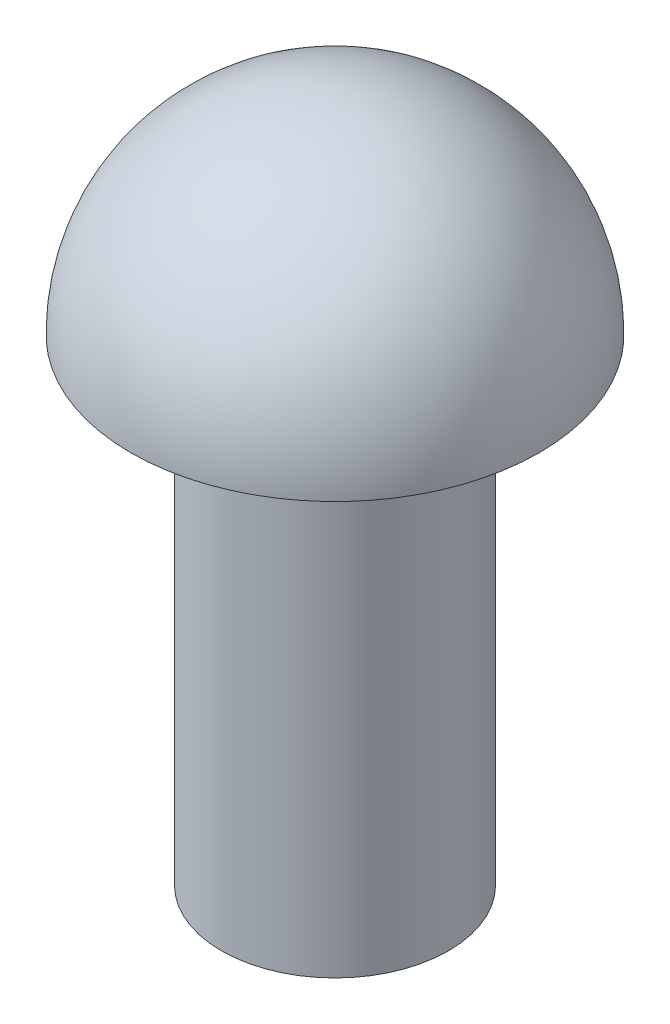
ISO-10303-21;
HEADER;
FILE_DESCRIPTION(('STEP AP214'),'2;1');
FILE_NAME('part.step','',(''),(''),'','','');
FILE_SCHEMA(('AUTOMOTIVE_DESIGN { 1 0 10303 214 1 1 1 1 }'));
ENDSEC;
DATA;
#1=APPLICATION_CONTEXT('core data for automotive mechanical design processes');
#2=APPLICATION_PROTOCOL_DEFINITION('international standard','automotive_design',2000,#1);
#3=PRODUCT_CONTEXT('',#1,'mechanical');
#4=PRODUCT('Part','Part','',(#3));
#5=PRODUCT_RELATED_PRODUCT_CATEGORY('part','',(#4));
#6=PRODUCT_DEFINITION_FORMATION('','',#4);
#7=PRODUCT_DEFINITION_CONTEXT('part definition',#1,'design');
#8=PRODUCT_DEFINITION('design','',#6,#7);
#9=PRODUCT_DEFINITION_SHAPE('','',#8);
#10=(LENGTH_UNIT() NAMED_UNIT(*) SI_UNIT(.MILLI.,.METRE.));
#11=(NAMED_UNIT(*) PLANE_ANGLE_UNIT() SI_UNIT($,.RADIAN.));
#12=(NAMED_UNIT(*) SI_UNIT($,.STERADIAN.) SOLID_ANGLE_UNIT());
#13=UNCERTAINTY_MEASURE_WITH_UNIT(LENGTH_MEASURE(1.E-05),#10,'distance_accuracy_value','');
#14=(GEOMETRIC_REPRESENTATION_CONTEXT(3) GLOBAL_UNCERTAINTY_ASSIGNED_CONTEXT((#13)) GLOBAL_UNIT_ASSIGNED_CONTEXT((#10,
#11,#12)) REPRESENTATION_CONTEXT('',''));
#15=CARTESIAN_POINT('',(0.,0.,0.));
#16=DIRECTION('',(0.,0.,1.));
#17=DIRECTION('',(1.,0.,0.));
#18=AXIS2_PLACEMENT_3D('',#15,#16,#17);
#19=CARTESIAN_POINT('',(0.,-21.,0.));
#20=DIRECTION('',(0.,1.,0.));
#21=DIRECTION('',(0.,0.,1.));
#22=AXIS2_PLACEMENT_3D('',#19,#20,#21);
#23=CYLINDRICAL_SURFACE('',#22,5.);
#24=CARTESIAN_POINT('',(0.,-21.,0.));
#25=DIRECTION('',(0.,1.,0.));
#26=DIRECTION('',(0.,0.,1.));
#27=AXIS2_PLACEMENT_3D('',#24,#25,#26);
#28=CIRCLE('',#27,5.);
#29=CARTESIAN_POINT('',(0.,-21.,5.));
#30=VERTEX_POINT('',#29);
#31=EDGE_CURVE('E10',#30,#30,#28,.T.);
#32=CARTESIAN_POINT('',(0.,0.,0.));
#33=DIRECTION('',(0.,1.,0.));
#34=DIRECTION('',(0.,0.,1.));
#35=AXIS2_PLACEMENT_3D('',#32,#33,#34);
#36=CIRCLE('',#35,5.);
#37=CARTESIAN_POINT('',(0.,0.,5.));
#38=VERTEX_POINT('',#37);
#39=EDGE_CURVE('E46',#38,#38,#36,.T.);
#40=CARTESIAN_POINT('',(0.,-21.,5.));
#41=CARTESIAN_POINT('',(0.,-20.78125,5.));
#42=CARTESIAN_POINT('',(0.,-20.5625,5.));
#43=CARTESIAN_POINT('',(0.,-20.125,5.));
#44=CARTESIAN_POINT('',(0.,-19.90625,5.));
#45=CARTESIAN_POINT('',(0.,-19.46875,5.));
#46=CARTESIAN_POINT('',(0.,-19.25,5.));
#47=CARTESIAN_POINT('',(0.,-18.8125,5.));
#48=CARTESIAN_POINT('',(0.,-18.59375,5.));
#49=CARTESIAN_POINT('',(0.,-18.15625,5.));
#50=CARTESIAN_POINT('',(0.,-17.9375,5.));
#51=CARTESIAN_POINT('',(0.,-17.5,5.));
#52=CARTESIAN_POINT('',(0.,-17.28125,5.));
#53=CARTESIAN_POINT('',(0.,-16.84375,5.));
#54=CARTESIAN_POINT('',(0.,-16.625,5.));
#55=CARTESIAN_POINT('',(0.,-16.1875,5.));
#56=CARTESIAN_POINT('',(0.,-15.96875,5.));
#57=CARTESIAN_POINT('',(0.,-15.53125,5.));
#58=CARTESIAN_POINT('',(0.,-15.3125,5.));
#59=CARTESIAN_POINT('',(0.,-14.875,5.));
#60=CARTESIAN_POINT('',(0.,-14.65625,5.));
#61=CARTESIAN_POINT('',(0.,-14.21875,5.));
#62=CARTESIAN_POINT('',(0.,-14.,5.));
#63=CARTESIAN_POINT('',(0.,-13.5625,5.));
#64=CARTESIAN_POINT('',(0.,-13.34375,5.));
#65=CARTESIAN_POINT('',(0.,-12.90625,5.));
#66=CARTESIAN_POINT('',(0.,-12.6875,5.));
#67=CARTESIAN_POINT('',(0.,-12.25,5.));
#68=CARTESIAN_POINT('',(0.,-12.03125,5.));
#69=CARTESIAN_POINT('',(0.,-11.59375,5.));
#70=CARTESIAN_POINT('',(0.,-11.375,5.));
#71=CARTESIAN_POINT('',(0.,-10.9375,5.));
#72=CARTESIAN_POINT('',(0.,-10.71875,5.));
#73=CARTESIAN_POINT('',(0.,-10.28125,5.));
#74=CARTESIAN_POINT('',(0.,-10.0625,5.));
#75=CARTESIAN_POINT('',(0.,-9.625,5.));
#76=CARTESIAN_POINT('',(0.,-9.40625,5.));
#77=CARTESIAN_POINT('',(0.,-8.96875,5.));
#78=CARTESIAN_POINT('',(0.,-8.75,5.));
#79=CARTESIAN_POINT('',(0.,-8.3125,5.));
#80=CARTESIAN_POINT('',(0.,-8.09375,5.));
#81=CARTESIAN_POINT('',(0.,-7.65625,5.));
#82=CARTESIAN_POINT('',(0.,-7.4375,5.));
#83=CARTESIAN_POINT('',(0.,-7.,5.));
#84=CARTESIAN_POINT('',(0.,-6.78125,5.));
#85=CARTESIAN_POINT('',(0.,-6.34375,5.));
#86=CARTESIAN_POINT('',(0.,-6.125,5.));
#87=CARTESIAN_POINT('',(0.,-5.6875,5.));
#88=CARTESIAN_POINT('',(0.,-5.46875,5.));
#89=CARTESIAN_POINT('',(0.,-5.03125,5.));
#90=CARTESIAN_POINT('',(0.,-4.8125,5.));
#91=CARTESIAN_POINT('',(0.,-4.375,5.));
#92=CARTESIAN_POINT('',(0.,-4.15625,5.));
#93=CARTESIAN_POINT('',(0.,-3.71875,5.));
#94=CARTESIAN_POINT('',(0.,-3.5,5.));
#95=CARTESIAN_POINT('',(0.,-3.0625,5.));
#96=CARTESIAN_POINT('',(0.,-2.84375,5.));
#97=CARTESIAN_POINT('',(0.,-2.40625,5.));
#98=CARTESIAN_POINT('',(0.,-2.1875,5.));
#99=CARTESIAN_POINT('',(0.,-1.75,5.));
#100=CARTESIAN_POINT('',(0.,-1.53125,5.));
#101=CARTESIAN_POINT('',(0.,-1.09375,5.));
#102=CARTESIAN_POINT('',(0.,-0.875000000000001,5.));
#103=CARTESIAN_POINT('',(0.,-0.4375,5.));
#104=CARTESIAN_POINT('',(0.,-0.21875,5.));
#105=CARTESIAN_POINT('',(0.,0.,5.));
#106=B_SPLINE_CURVE_WITH_KNOTS('',3,(#40,#41,#42,#43,#44,#45,#46,#47,#48,#49,#50,#51,#52,#53,
#54,#55,#56,#57,#58,#59,#60,#61,#62,#63,#64,#65,#66,#67,#68,#69,#70,#71,#72,#73,#74,#75,#76,#77,
#78,#79,#80,#81,#82,#83,#84,#85,#86,#87,#88,#89,#90,#91,#92,#93,#94,#95,#96,#97,#98,#99,#100,
#101,#102,#103,#104,#105),.UNSPECIFIED.,.F.,.F.,(4,2,2,2,2,2,2,2,2,2,2,2,2,2,2,2,2,2,2,2,2,2,2,
2,2,2,2,2,2,2,2,2,4),(0.,0.656250000000001,1.3125,1.96875,2.625,3.28125,3.9375,4.59375,5.25,
5.90625,6.5625,7.21875,7.875,8.53125,9.1875,9.84375,10.5,11.15625,11.8125,12.46875,13.125,
13.78125,14.4375,15.09375,15.75,16.40625,17.0625,17.71875,18.375,19.03125,19.6875,20.34375,21.),.UNSPECIFIED.);
#107=EDGE_CURVE('BSEAM43',#30,#38,#106,.T.);
#108=ORIENTED_EDGE('',*,*,#31,.T.);
#109=ORIENTED_EDGE('',*,*,#39,.F.);
#110=ORIENTED_EDGE('',*,*,#107,.T.);
#111=ORIENTED_EDGE('',*,*,#107,.F.);
#112=EDGE_LOOP('',(#108,#110,#109,#111));
#113=FACE_BOUND('',#112,.T.);
#114=ADVANCED_FACE('F43',(#113),#23,.T.);
#115=CARTESIAN_POINT('',(0.,-21.,0.));
#116=DIRECTION('',(0.,1.,0.));
#117=DIRECTION('',(0.,0.,1.));
#118=AXIS2_PLACEMENT_3D('',#115,#116,#117);
#119=PLANE('',#118);
#120=ORIENTED_EDGE('',*,*,#31,.F.);
#121=EDGE_LOOP('',(#120));
#122=FACE_BOUND('',#121,.T.);
#123=ADVANCED_FACE('F70',(#122),#119,.F.);
#124=CARTESIAN_POINT('',(9.,0.,0.));
#125=DIRECTION('',(0.,1.,0.));
#126=DIRECTION('',(-1.,0.,0.));
#127=AXIS2_PLACEMENT_3D('',#124,#125,#126);
#128=PLANE('',#127);
#129=ORIENTED_EDGE('',*,*,#39,.T.);
#130=EDGE_LOOP('',(#129));
#131=FACE_BOUND('',#130,.T.);
#132=CARTESIAN_POINT('',(0.,0.,0.));
#133=DIRECTION('',(0.,1.,0.));
#134=DIRECTION('',(-1.,0.,0.));
#135=AXIS2_PLACEMENT_3D('',#132,#133,#134);
#136=CIRCLE('',#135,9.);
#137=CARTESIAN_POINT('',(-9.,0.,0.));
#138=VERTEX_POINT('',#137);
#139=EDGE_CURVE('E57',#138,#138,#136,.T.);
#140=ORIENTED_EDGE('',*,*,#139,.F.);
#141=EDGE_LOOP('',(#140));
#142=FACE_BOUND('',#141,.T.);
#143=ADVANCED_FACE('F62',(#131,#142),#128,.F.);
#144=CARTESIAN_POINT('',(0.,0.,0.));
#145=DIRECTION('',(0.,1.,0.));
#146=DIRECTION('',(1.,0.,0.));
#147=AXIS2_PLACEMENT_3D('',#144,#145,#146);
#148=SPHERICAL_SURFACE('',#147,9.);
#149=ORIENTED_EDGE('',*,*,#139,.T.);
#150=EDGE_LOOP('',(#149));
#151=FACE_BOUND('',#150,.T.);
#152=ADVANCED_FACE('F65',(#151),#148,.T.);
#153=CLOSED_SHELL('',(#114,#123,#143,#152));
#154=MANIFOLD_SOLID_BREP('B2',#153);
#155=ADVANCED_BREP_SHAPE_REPRESENTATION('',(#18,#154),#14);
#156=SHAPE_DEFINITION_REPRESENTATION(#9,#155);
ENDSEC;
END-ISO-10303-21;
